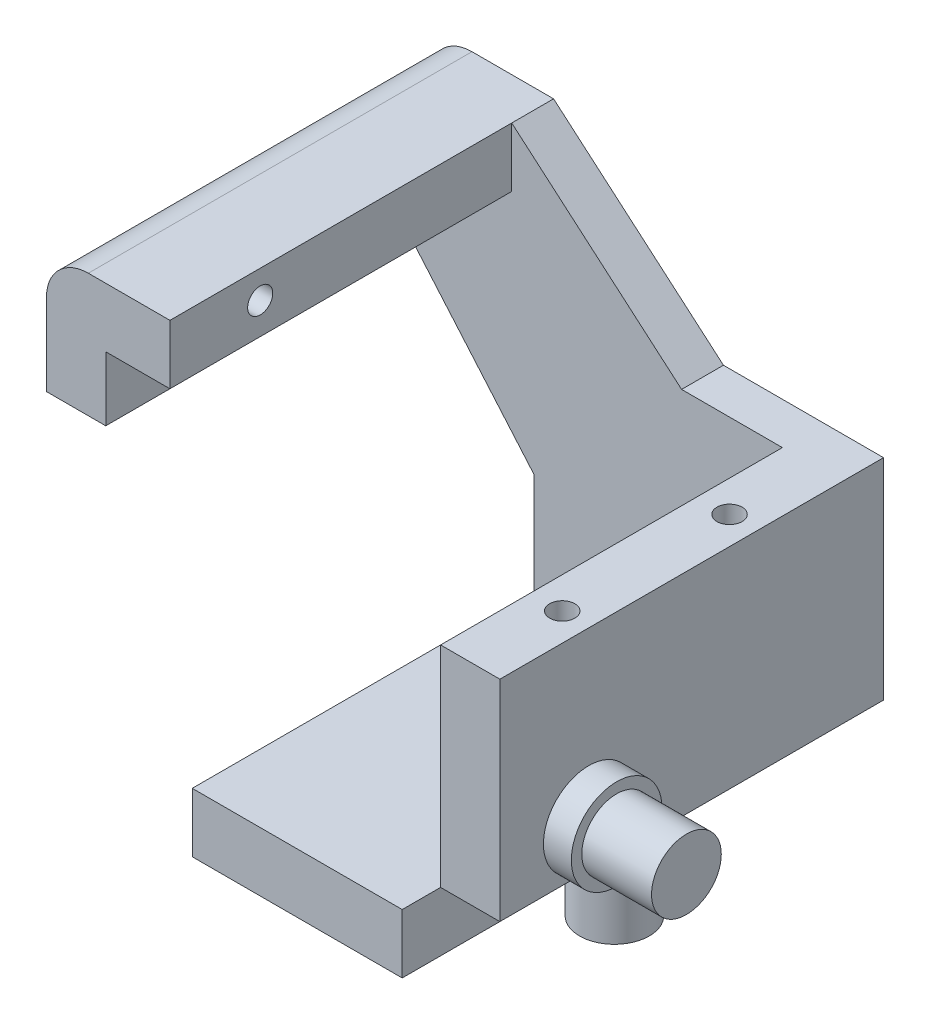
ISO-10303-21;
HEADER;
FILE_DESCRIPTION(('STEP AP214'),'2;1');
FILE_NAME('part.step','',(''),(''),'','','');
FILE_SCHEMA(('AUTOMOTIVE_DESIGN { 1 0 10303 214 1 1 1 1 }'));
ENDSEC;
DATA;
#1=APPLICATION_CONTEXT('core data for automotive mechanical design processes');
#2=APPLICATION_PROTOCOL_DEFINITION('international standard','automotive_design',2000,#1);
#3=PRODUCT_CONTEXT('',#1,'mechanical');
#4=PRODUCT('Part','Part','',(#3));
#5=PRODUCT_RELATED_PRODUCT_CATEGORY('part','',(#4));
#6=PRODUCT_DEFINITION_FORMATION('','',#4);
#7=PRODUCT_DEFINITION_CONTEXT('part definition',#1,'design');
#8=PRODUCT_DEFINITION('design','',#6,#7);
#9=PRODUCT_DEFINITION_SHAPE('','',#8);
#10=(LENGTH_UNIT() NAMED_UNIT(*) SI_UNIT(.MILLI.,.METRE.));
#11=(NAMED_UNIT(*) PLANE_ANGLE_UNIT() SI_UNIT($,.RADIAN.));
#12=(NAMED_UNIT(*) SI_UNIT($,.STERADIAN.) SOLID_ANGLE_UNIT());
#13=UNCERTAINTY_MEASURE_WITH_UNIT(LENGTH_MEASURE(1.E-05),#10,'distance_accuracy_value','');
#14=(GEOMETRIC_REPRESENTATION_CONTEXT(3) GLOBAL_UNCERTAINTY_ASSIGNED_CONTEXT((#13)) GLOBAL_UNIT_ASSIGNED_CONTEXT((#10,
#11,#12)) REPRESENTATION_CONTEXT('',''));
#15=CARTESIAN_POINT('',(0.,0.,0.));
#16=DIRECTION('',(0.,0.,1.));
#17=DIRECTION('',(1.,0.,0.));
#18=AXIS2_PLACEMENT_3D('',#15,#16,#17);
#19=CARTESIAN_POINT('',(-16.25,-16.25,27.5));
#20=DIRECTION('',(1.,0.,0.));
#21=DIRECTION('',(0.,0.,-1.));
#22=AXIS2_PLACEMENT_3D('',#19,#20,#21);
#23=PLANE('',#22);
#24=DIRECTION('',(0.,0.,1.));
#25=VECTOR('',#24,1.);
#26=CARTESIAN_POINT('',(-16.25,7.4,0.));
#27=LINE('',#26,#25);
#28=CARTESIAN_POINT('',(-16.25,7.4,0.));
#29=VERTEX_POINT('',#28);
#30=CARTESIAN_POINT('',(-16.25,7.4,3.));
#31=VERTEX_POINT('',#30);
#32=EDGE_CURVE('E169',#29,#31,#27,.T.);
#33=ORIENTED_EDGE('',*,*,#32,.T.);
#34=DIRECTION('',(0.,0.,1.));
#35=VECTOR('',#34,1.);
#36=CARTESIAN_POINT('',(-16.25,7.4,3.));
#37=LINE('',#36,#35);
#38=CARTESIAN_POINT('',(-16.25,7.4,27.5));
#39=VERTEX_POINT('',#38);
#40=EDGE_CURVE('E241',#31,#39,#37,.T.);
#41=ORIENTED_EDGE('',*,*,#40,.T.);
#42=DIRECTION('',(0.,-1.,0.));
#43=VECTOR('',#42,1.);
#44=CARTESIAN_POINT('',(-16.25,-16.25,27.5));
#45=LINE('',#44,#43);
#46=CARTESIAN_POINT('',(-16.25,13.25,27.5));
#47=VERTEX_POINT('',#46);
#48=EDGE_CURVE('E84',#47,#39,#45,.T.);
#49=ORIENTED_EDGE('',*,*,#48,.F.);
#50=DIRECTION('',(0.,0.,-1.));
#51=VECTOR('',#50,1.);
#52=CARTESIAN_POINT('',(-16.25,13.25,27.5));
#53=LINE('',#52,#51);
#54=CARTESIAN_POINT('',(-16.25,13.25,0.));
#55=VERTEX_POINT('',#54);
#56=EDGE_CURVE('E77',#47,#55,#53,.T.);
#57=ORIENTED_EDGE('',*,*,#56,.T.);
#58=DIRECTION('',(0.,-1.,0.));
#59=VECTOR('',#58,1.);
#60=CARTESIAN_POINT('',(-16.25,-16.25,0.));
#61=LINE('',#60,#59);
#62=EDGE_CURVE('E91',#55,#29,#61,.T.);
#63=ORIENTED_EDGE('',*,*,#62,.T.);
#64=EDGE_LOOP('',(#33,#41,#49,#57,#63));
#65=FACE_BOUND('',#64,.T.);
#66=ADVANCED_FACE('F36',(#65),#23,.F.);
#67=CARTESIAN_POINT('',(-16.25,-16.25,27.5));
#68=DIRECTION('',(0.,1.,0.));
#69=DIRECTION('',(0.,0.,1.));
#70=AXIS2_PLACEMENT_3D('',#67,#68,#69);
#71=PLANE('',#70);
#72=DIRECTION('',(0.,0.,1.));
#73=VECTOR('',#72,1.);
#74=CARTESIAN_POINT('',(-5.80000000000001,-16.25,3.));
#75=LINE('',#74,#73);
#76=CARTESIAN_POINT('',(-5.80000000000001,-16.25,0.));
#77=VERTEX_POINT('',#76);
#78=CARTESIAN_POINT('',(-5.80000000000001,-16.25,27.5));
#79=VERTEX_POINT('',#78);
#80=EDGE_CURVE('E230',#77,#79,#75,.T.);
#81=ORIENTED_EDGE('',*,*,#80,.F.);
#82=DIRECTION('',(1.,0.,0.));
#83=VECTOR('',#82,1.);
#84=CARTESIAN_POINT('',(-16.25,-16.25,0.));
#85=LINE('',#84,#83);
#86=CARTESIAN_POINT('',(9.25,-16.25,0.));
#87=VERTEX_POINT('',#86);
#88=EDGE_CURVE('E99',#77,#87,#85,.T.);
#89=ORIENTED_EDGE('',*,*,#88,.T.);
#90=DIRECTION('',(0.,0.,1.));
#91=VECTOR('',#90,1.);
#92=CARTESIAN_POINT('',(9.25,-16.25,0.));
#93=LINE('',#92,#91);
#94=CARTESIAN_POINT('',(9.25,-16.25,9.04));
#95=VERTEX_POINT('',#94);
#96=EDGE_CURVE('E207',#87,#95,#93,.T.);
#97=ORIENTED_EDGE('',*,*,#96,.T.);
#98=CARTESIAN_POINT('',(6.,-16.25,9.04));
#99=DIRECTION('',(0.,1.,0.));
#100=DIRECTION('',(0.,0.,1.));
#101=AXIS2_PLACEMENT_3D('',#98,#99,#100);
#102=CIRCLE('',#101,3.25);
#103=EDGE_CURVE('E115',#95,#95,#102,.F.);
#104=ORIENTED_EDGE('',*,*,#103,.F.);
#105=CARTESIAN_POINT('',(9.25,-16.25,27.5));
#106=VERTEX_POINT('',#105);
#107=EDGE_CURVE('E211',#95,#106,#93,.T.);
#108=ORIENTED_EDGE('',*,*,#107,.T.);
#109=DIRECTION('',(1.,0.,0.));
#110=VECTOR('',#109,1.);
#111=CARTESIAN_POINT('',(-16.25,-16.25,27.5));
#112=LINE('',#111,#110);
#113=EDGE_CURVE('E289',#79,#106,#112,.T.);
#114=ORIENTED_EDGE('',*,*,#113,.F.);
#115=EDGE_LOOP('',(#81,#89,#97,#104,#108,#114));
#116=FACE_BOUND('',#115,.T.);
#117=ADVANCED_FACE('F425',(#116),#71,.F.);
#118=CARTESIAN_POINT('',(-13.25,13.25,0.));
#119=DIRECTION('',(0.,0.,1.));
#120=DIRECTION('',(1.,0.,0.));
#121=AXIS2_PLACEMENT_3D('',#118,#119,#120);
#122=PLANE('',#121);
#123=DIRECTION('',(0.651281240201258,-0.758836442299598,0.));
#124=VECTOR('',#123,1.);
#125=CARTESIAN_POINT('',(-5.8,-4.77575500805203,0.));
#126=LINE('',#125,#124);
#127=CARTESIAN_POINT('',(-5.8,-4.77575500805203,0.));
#128=VERTEX_POINT('',#127);
#129=EDGE_CURVE('E98',#29,#128,#126,.T.);
#130=ORIENTED_EDGE('',*,*,#129,.F.);
#131=ORIENTED_EDGE('',*,*,#62,.F.);
#132=CARTESIAN_POINT('',(-13.25,13.25,0.));
#133=DIRECTION('',(0.,0.,1.));
#134=DIRECTION('',(1.,0.,0.));
#135=AXIS2_PLACEMENT_3D('',#132,#133,#134);
#136=CIRCLE('',#135,3.);
#137=CARTESIAN_POINT('',(-13.25,16.25,0.));
#138=VERTEX_POINT('',#137);
#139=EDGE_CURVE('E74',#138,#55,#136,.T.);
#140=ORIENTED_EDGE('',*,*,#139,.F.);
#141=DIRECTION('',(-1.,0.,0.));
#142=VECTOR('',#141,1.);
#143=CARTESIAN_POINT('',(-13.25,16.25,0.));
#144=LINE('',#143,#142);
#145=CARTESIAN_POINT('',(-7.4,16.25,0.));
#146=VERTEX_POINT('',#145);
#147=EDGE_CURVE('E85',#146,#138,#144,.T.);
#148=ORIENTED_EDGE('',*,*,#147,.F.);
#149=DIRECTION('',(0.758836442299598,-0.651281240201258,0.));
#150=VECTOR('',#149,1.);
#151=CARTESIAN_POINT('',(4.77575500805203,5.8,0.));
#152=LINE('',#151,#150);
#153=CARTESIAN_POINT('',(4.77575500805203,5.8,0.));
#154=VERTEX_POINT('',#153);
#155=EDGE_CURVE('E174',#146,#154,#152,.T.);
#156=ORIENTED_EDGE('',*,*,#155,.T.);
#157=DIRECTION('',(1.,0.,0.));
#158=VECTOR('',#157,1.);
#159=CARTESIAN_POINT('',(16.25,5.8,0.));
#160=LINE('',#159,#158);
#161=CARTESIAN_POINT('',(16.25,5.8,0.));
#162=VERTEX_POINT('',#161);
#163=EDGE_CURVE('E177',#154,#162,#160,.T.);
#164=ORIENTED_EDGE('',*,*,#163,.T.);
#165=DIRECTION('',(0.,1.,0.));
#166=VECTOR('',#165,1.);
#167=CARTESIAN_POINT('',(16.25,-16.25,0.));
#168=LINE('',#167,#166);
#169=CARTESIAN_POINT('',(16.25,-9.25,0.));
#170=VERTEX_POINT('',#169);
#171=EDGE_CURVE('E103',#170,#162,#168,.T.);
#172=ORIENTED_EDGE('',*,*,#171,.F.);
#173=DIRECTION('',(-1.,0.,0.));
#174=VECTOR('',#173,1.);
#175=CARTESIAN_POINT('',(16.25,-9.25,0.));
#176=LINE('',#175,#174);
#177=CARTESIAN_POINT('',(12.,-9.25,0.));
#178=VERTEX_POINT('',#177);
#179=EDGE_CURVE('E192',#170,#178,#176,.T.);
#180=ORIENTED_EDGE('',*,*,#179,.T.);
#181=CARTESIAN_POINT('',(12.,-12.,0.));
#182=DIRECTION('',(0.,0.,1.));
#183=DIRECTION('',(1.,0.,0.));
#184=AXIS2_PLACEMENT_3D('',#181,#182,#183);
#185=CIRCLE('',#184,2.75);
#186=CARTESIAN_POINT('',(9.25,-12.,0.));
#187=VERTEX_POINT('',#186);
#188=EDGE_CURVE('E195',#178,#187,#185,.T.);
#189=ORIENTED_EDGE('',*,*,#188,.T.);
#190=DIRECTION('',(0.,-1.,0.));
#191=VECTOR('',#190,1.);
#192=CARTESIAN_POINT('',(9.25,-16.25,0.));
#193=LINE('',#192,#191);
#194=EDGE_CURVE('E199',#187,#87,#193,.T.);
#195=ORIENTED_EDGE('',*,*,#194,.T.);
#196=ORIENTED_EDGE('',*,*,#88,.F.);
#197=DIRECTION('',(0.,-1.,0.));
#198=VECTOR('',#197,1.);
#199=CARTESIAN_POINT('',(-5.80000000000001,-16.25,0.));
#200=LINE('',#199,#198);
#201=EDGE_CURVE('E159',#128,#77,#200,.T.);
#202=ORIENTED_EDGE('',*,*,#201,.F.);
#203=EDGE_LOOP('',(#130,#131,#140,#148,#156,#164,#172,#180,#189,#195,#196,#202));
#204=FACE_BOUND('',#203,.T.);
#205=ADVANCED_FACE('F95',(#204),#122,.F.);
#206=CARTESIAN_POINT('',(0.,0.,3.));
#207=DIRECTION('',(0.,0.,-1.));
#208=DIRECTION('',(-1.,0.,0.));
#209=AXIS2_PLACEMENT_3D('',#206,#207,#208);
#210=PLANE('',#209);
#211=DIRECTION('',(0.651281240201258,-0.758836442299598,0.));
#212=VECTOR('',#211,1.);
#213=CARTESIAN_POINT('',(-5.8,-4.77575500805203,3.));
#214=LINE('',#213,#212);
#215=CARTESIAN_POINT('',(-5.8,-4.77575500805203,3.));
#216=VERTEX_POINT('',#215);
#217=EDGE_CURVE('E162',#31,#216,#214,.T.);
#218=ORIENTED_EDGE('',*,*,#217,.T.);
#219=DIRECTION('',(0.,-1.,0.));
#220=VECTOR('',#219,1.);
#221=CARTESIAN_POINT('',(-5.80000000000001,-16.25,3.));
#222=LINE('',#221,#220);
#223=CARTESIAN_POINT('',(-5.80000000000001,-12.,3.));
#224=VERTEX_POINT('',#223);
#225=EDGE_CURVE('E150',#216,#224,#222,.T.);
#226=ORIENTED_EDGE('',*,*,#225,.T.);
#227=DIRECTION('',(1.,0.,0.));
#228=VECTOR('',#227,1.);
#229=CARTESIAN_POINT('',(-12.,-12.,3.));
#230=LINE('',#229,#228);
#231=CARTESIAN_POINT('',(9.25,-12.,3.));
#232=VERTEX_POINT('',#231);
#233=EDGE_CURVE('E271',#224,#232,#230,.T.);
#234=ORIENTED_EDGE('',*,*,#233,.T.);
#235=CARTESIAN_POINT('',(12.,-12.,3.));
#236=DIRECTION('',(0.,0.,-1.));
#237=DIRECTION('',(-1.,0.,0.));
#238=AXIS2_PLACEMENT_3D('',#235,#236,#237);
#239=CIRCLE('',#238,2.75);
#240=CARTESIAN_POINT('',(12.,-9.25,3.));
#241=VERTEX_POINT('',#240);
#242=EDGE_CURVE('E39',#232,#241,#239,.T.);
#243=ORIENTED_EDGE('',*,*,#242,.T.);
#244=DIRECTION('',(0.,1.,0.));
#245=VECTOR('',#244,1.);
#246=CARTESIAN_POINT('',(12.,-12.,3.));
#247=LINE('',#246,#245);
#248=CARTESIAN_POINT('',(12.,5.8,3.));
#249=VERTEX_POINT('',#248);
#250=EDGE_CURVE('E274',#241,#249,#247,.T.);
#251=ORIENTED_EDGE('',*,*,#250,.T.);
#252=DIRECTION('',(1.,0.,0.));
#253=VECTOR('',#252,1.);
#254=CARTESIAN_POINT('',(16.25,5.8,3.));
#255=LINE('',#254,#253);
#256=CARTESIAN_POINT('',(4.77575500805203,5.8,3.));
#257=VERTEX_POINT('',#256);
#258=EDGE_CURVE('E178',#257,#249,#255,.T.);
#259=ORIENTED_EDGE('',*,*,#258,.F.);
#260=DIRECTION('',(0.758836442299598,-0.651281240201258,0.));
#261=VECTOR('',#260,1.);
#262=CARTESIAN_POINT('',(4.77575500805203,5.8,3.));
#263=LINE('',#262,#261);
#264=CARTESIAN_POINT('',(-7.4,16.25,3.));
#265=VERTEX_POINT('',#264);
#266=EDGE_CURVE('E171',#265,#257,#263,.T.);
#267=ORIENTED_EDGE('',*,*,#266,.F.);
#268=DIRECTION('',(0.,-1.,0.));
#269=VECTOR('',#268,1.);
#270=CARTESIAN_POINT('',(-7.4,16.25,3.));
#271=LINE('',#270,#269);
#272=CARTESIAN_POINT('',(-7.4,12.,3.));
#273=VERTEX_POINT('',#272);
#274=EDGE_CURVE('E247',#265,#273,#271,.T.);
#275=ORIENTED_EDGE('',*,*,#274,.T.);
#276=DIRECTION('',(-1.,0.,0.));
#277=VECTOR('',#276,1.);
#278=CARTESIAN_POINT('',(-12.,12.,3.));
#279=LINE('',#278,#277);
#280=CARTESIAN_POINT('',(-12.,12.,3.));
#281=VERTEX_POINT('',#280);
#282=EDGE_CURVE('E106',#273,#281,#279,.T.);
#283=ORIENTED_EDGE('',*,*,#282,.T.);
#284=DIRECTION('',(0.,-1.,0.));
#285=VECTOR('',#284,1.);
#286=CARTESIAN_POINT('',(-12.,-12.,3.));
#287=LINE('',#286,#285);
#288=CARTESIAN_POINT('',(-12.,7.4,3.));
#289=VERTEX_POINT('',#288);
#290=EDGE_CURVE('E268',#281,#289,#287,.T.);
#291=ORIENTED_EDGE('',*,*,#290,.T.);
#292=DIRECTION('',(1.,0.,0.));
#293=VECTOR('',#292,1.);
#294=CARTESIAN_POINT('',(-16.25,7.4,3.));
#295=LINE('',#294,#293);
#296=EDGE_CURVE('E227',#31,#289,#295,.T.);
#297=ORIENTED_EDGE('',*,*,#296,.F.);
#298=EDGE_LOOP('',(#218,#226,#234,#243,#251,#259,#267,#275,#283,#291,#297));
#299=FACE_BOUND('',#298,.T.);
#300=ADVANCED_FACE('F403',(#299),#210,.F.);
#301=CARTESIAN_POINT('',(-13.25,13.25,27.5));
#302=DIRECTION('',(0.,0.,1.));
#303=DIRECTION('',(1.,0.,0.));
#304=AXIS2_PLACEMENT_3D('',#301,#302,#303);
#305=PLANE('',#304);
#306=DIRECTION('',(0.,-1.,0.));
#307=VECTOR('',#306,1.);
#308=CARTESIAN_POINT('',(9.25,-16.25,27.5));
#309=LINE('',#308,#307);
#310=CARTESIAN_POINT('',(9.25,-12.,27.5));
#311=VERTEX_POINT('',#310);
#312=EDGE_CURVE('E196',#311,#106,#309,.T.);
#313=ORIENTED_EDGE('',*,*,#312,.F.);
#314=DIRECTION('',(1.,0.,0.));
#315=VECTOR('',#314,1.);
#316=CARTESIAN_POINT('',(-12.,-12.,27.5));
#317=LINE('',#316,#315);
#318=CARTESIAN_POINT('',(-5.80000000000001,-12.,27.5));
#319=VERTEX_POINT('',#318);
#320=EDGE_CURVE('E280',#319,#311,#317,.T.);
#321=ORIENTED_EDGE('',*,*,#320,.F.);
#322=DIRECTION('',(0.,1.,0.));
#323=VECTOR('',#322,1.);
#324=CARTESIAN_POINT('',(-5.80000000000001,-16.25,27.5));
#325=LINE('',#324,#323);
#326=EDGE_CURVE('E231',#79,#319,#325,.T.);
#327=ORIENTED_EDGE('',*,*,#326,.F.);
#328=ORIENTED_EDGE('',*,*,#113,.T.);
#329=EDGE_LOOP('',(#313,#321,#327,#328));
#330=FACE_BOUND('',#329,.T.);
#331=ADVANCED_FACE('F449',(#330),#305,.T.);
#332=ORIENTED_EDGE('',*,*,#48,.T.);
#333=DIRECTION('',(1.,0.,0.));
#334=VECTOR('',#333,1.);
#335=CARTESIAN_POINT('',(-16.25,7.4,27.5));
#336=LINE('',#335,#334);
#337=CARTESIAN_POINT('',(-12.,7.4,27.5));
#338=VERTEX_POINT('',#337);
#339=EDGE_CURVE('E226',#39,#338,#336,.T.);
#340=ORIENTED_EDGE('',*,*,#339,.T.);
#341=DIRECTION('',(0.,-1.,0.));
#342=VECTOR('',#341,1.);
#343=CARTESIAN_POINT('',(-12.,-12.,27.5));
#344=LINE('',#343,#342);
#345=CARTESIAN_POINT('',(-12.,12.,27.5));
#346=VERTEX_POINT('',#345);
#347=EDGE_CURVE('E267',#346,#338,#344,.T.);
#348=ORIENTED_EDGE('',*,*,#347,.F.);
#349=DIRECTION('',(-1.,0.,0.));
#350=VECTOR('',#349,1.);
#351=CARTESIAN_POINT('',(-12.,12.,27.5));
#352=LINE('',#351,#350);
#353=CARTESIAN_POINT('',(-7.4,12.,27.5));
#354=VERTEX_POINT('',#353);
#355=EDGE_CURVE('E272',#354,#346,#352,.T.);
#356=ORIENTED_EDGE('',*,*,#355,.F.);
#357=DIRECTION('',(0.,-1.,0.));
#358=VECTOR('',#357,1.);
#359=CARTESIAN_POINT('',(-7.4,16.25,27.5));
#360=LINE('',#359,#358);
#361=CARTESIAN_POINT('',(-7.4,16.25,27.5));
#362=VERTEX_POINT('',#361);
#363=EDGE_CURVE('E251',#362,#354,#360,.T.);
#364=ORIENTED_EDGE('',*,*,#363,.F.);
#365=DIRECTION('',(-1.,0.,0.));
#366=VECTOR('',#365,1.);
#367=CARTESIAN_POINT('',(-13.25,16.25,27.5));
#368=LINE('',#367,#366);
#369=CARTESIAN_POINT('',(-13.25,16.25,27.5));
#370=VERTEX_POINT('',#369);
#371=EDGE_CURVE('E294',#362,#370,#368,.T.);
#372=ORIENTED_EDGE('',*,*,#371,.T.);
#373=CARTESIAN_POINT('',(-13.25,13.25,27.5));
#374=DIRECTION('',(0.,0.,1.));
#375=DIRECTION('',(1.,0.,0.));
#376=AXIS2_PLACEMENT_3D('',#373,#374,#375);
#377=CIRCLE('',#376,3.);
#378=EDGE_CURVE('E61',#370,#47,#377,.T.);
#379=ORIENTED_EDGE('',*,*,#378,.T.);
#380=EDGE_LOOP('',(#332,#340,#348,#356,#364,#372,#379));
#381=FACE_BOUND('',#380,.T.);
#382=ADVANCED_FACE('F297',(#381),#305,.T.);
#383=CARTESIAN_POINT('',(-12.,-12.,3.));
#384=DIRECTION('',(-1.,0.,0.));
#385=DIRECTION('',(0.,0.,1.));
#386=AXIS2_PLACEMENT_3D('',#383,#384,#385);
#387=PLANE('',#386);
#388=DIRECTION('',(0.,0.,1.));
#389=VECTOR('',#388,1.);
#390=CARTESIAN_POINT('',(-12.,7.4,3.));
#391=LINE('',#390,#389);
#392=EDGE_CURVE('E238',#289,#338,#391,.T.);
#393=ORIENTED_EDGE('',*,*,#392,.F.);
#394=ORIENTED_EDGE('',*,*,#290,.F.);
#395=DIRECTION('',(0.,0.,1.));
#396=VECTOR('',#395,1.);
#397=CARTESIAN_POINT('',(-12.,12.,3.));
#398=LINE('',#397,#396);
#399=EDGE_CURVE('E100',#281,#346,#398,.T.);
#400=ORIENTED_EDGE('',*,*,#399,.T.);
#401=ORIENTED_EDGE('',*,*,#347,.T.);
#402=EDGE_LOOP('',(#393,#394,#400,#401));
#403=FACE_BOUND('',#402,.T.);
#404=ADVANCED_FACE('F380',(#403),#387,.F.);
#405=CARTESIAN_POINT('',(16.25,-16.25,27.5));
#406=DIRECTION('',(-1.,0.,0.));
#407=DIRECTION('',(0.,0.,1.));
#408=AXIS2_PLACEMENT_3D('',#405,#406,#407);
#409=PLANE('',#408);
#410=ORIENTED_EDGE('',*,*,#171,.T.);
#411=DIRECTION('',(0.,0.,1.));
#412=VECTOR('',#411,1.);
#413=CARTESIAN_POINT('',(16.25,5.8,3.));
#414=LINE('',#413,#412);
#415=CARTESIAN_POINT('',(16.25,5.8,27.5));
#416=VERTEX_POINT('',#415);
#417=EDGE_CURVE('E261',#162,#416,#414,.T.);
#418=ORIENTED_EDGE('',*,*,#417,.T.);
#419=DIRECTION('',(0.,1.,0.));
#420=VECTOR('',#419,1.);
#421=CARTESIAN_POINT('',(16.25,-16.25,27.5));
#422=LINE('',#421,#420);
#423=CARTESIAN_POINT('',(16.25,-9.25,27.5));
#424=VERTEX_POINT('',#423);
#425=EDGE_CURVE('E292',#424,#416,#422,.T.);
#426=ORIENTED_EDGE('',*,*,#425,.F.);
#427=DIRECTION('',(0.,0.,1.));
#428=VECTOR('',#427,1.);
#429=CARTESIAN_POINT('',(16.25,-9.25,0.));
#430=LINE('',#429,#428);
#431=CARTESIAN_POINT('',(16.25,-9.25,21.13));
#432=VERTEX_POINT('',#431);
#433=EDGE_CURVE('E202',#432,#424,#430,.T.);
#434=ORIENTED_EDGE('',*,*,#433,.F.);
#435=CARTESIAN_POINT('',(16.25,-6.,21.13));
#436=DIRECTION('',(-1.,0.,0.));
#437=DIRECTION('',(0.,0.,1.));
#438=AXIS2_PLACEMENT_3D('',#435,#436,#437);
#439=CIRCLE('',#438,3.25);
#440=EDGE_CURVE('E117',#432,#432,#439,.F.);
#441=ORIENTED_EDGE('',*,*,#440,.F.);
#442=EDGE_CURVE('E218',#170,#432,#430,.T.);
#443=ORIENTED_EDGE('',*,*,#442,.F.);
#444=EDGE_LOOP('',(#410,#418,#426,#434,#441,#443));
#445=FACE_BOUND('',#444,.T.);
#446=ADVANCED_FACE('F436',(#445),#409,.F.);
#447=DIRECTION('',(-1.,0.,0.));
#448=VECTOR('',#447,1.);
#449=CARTESIAN_POINT('',(16.25,-9.25,27.5));
#450=LINE('',#449,#448);
#451=CARTESIAN_POINT('',(12.,-9.25,27.5));
#452=VERTEX_POINT('',#451);
#453=EDGE_CURVE('E189',#424,#452,#450,.T.);
#454=ORIENTED_EDGE('',*,*,#453,.F.);
#455=ORIENTED_EDGE('',*,*,#425,.T.);
#456=DIRECTION('',(-1.,0.,0.));
#457=VECTOR('',#456,1.);
#458=CARTESIAN_POINT('',(16.25,5.8,27.5));
#459=LINE('',#458,#457);
#460=CARTESIAN_POINT('',(12.,5.8,27.5));
#461=VERTEX_POINT('',#460);
#462=EDGE_CURVE('E246',#416,#461,#459,.T.);
#463=ORIENTED_EDGE('',*,*,#462,.T.);
#464=DIRECTION('',(0.,1.,0.));
#465=VECTOR('',#464,1.);
#466=CARTESIAN_POINT('',(12.,-12.,27.5));
#467=LINE('',#466,#465);
#468=EDGE_CURVE('E283',#452,#461,#467,.T.);
#469=ORIENTED_EDGE('',*,*,#468,.F.);
#470=EDGE_LOOP('',(#454,#455,#463,#469));
#471=FACE_BOUND('',#470,.T.);
#472=ADVANCED_FACE('F439',(#471),#305,.T.);
#473=CARTESIAN_POINT('',(12.,-12.,3.));
#474=DIRECTION('',(1.,0.,0.));
#475=DIRECTION('',(0.,0.,-1.));
#476=AXIS2_PLACEMENT_3D('',#473,#474,#475);
#477=PLANE('',#476);
#478=ORIENTED_EDGE('',*,*,#250,.F.);
#479=DIRECTION('',(0.,0.,1.));
#480=VECTOR('',#479,1.);
#481=CARTESIAN_POINT('',(12.,-9.25,0.));
#482=LINE('',#481,#480);
#483=EDGE_CURVE('E217',#241,#452,#482,.T.);
#484=ORIENTED_EDGE('',*,*,#483,.T.);
#485=ORIENTED_EDGE('',*,*,#468,.T.);
#486=DIRECTION('',(0.,0.,1.));
#487=VECTOR('',#486,1.);
#488=CARTESIAN_POINT('',(12.,5.8,3.));
#489=LINE('',#488,#487);
#490=EDGE_CURVE('E264',#249,#461,#489,.T.);
#491=ORIENTED_EDGE('',*,*,#490,.F.);
#492=EDGE_LOOP('',(#478,#484,#485,#491));
#493=FACE_BOUND('',#492,.T.);
#494=ADVANCED_FACE('F443',(#493),#477,.F.);
#495=CARTESIAN_POINT('',(-13.25,16.25,27.5));
#496=DIRECTION('',(0.,-1.,0.));
#497=DIRECTION('',(0.,0.,-1.));
#498=AXIS2_PLACEMENT_3D('',#495,#496,#497);
#499=PLANE('',#498);
#500=DIRECTION('',(0.,0.,1.));
#501=VECTOR('',#500,1.);
#502=CARTESIAN_POINT('',(-7.4,16.25,3.));
#503=LINE('',#502,#501);
#504=EDGE_CURVE('E250',#265,#362,#503,.T.);
#505=ORIENTED_EDGE('',*,*,#504,.F.);
#506=DIRECTION('',(0.,0.,1.));
#507=VECTOR('',#506,1.);
#508=CARTESIAN_POINT('',(-7.4,16.25,0.));
#509=LINE('',#508,#507);
#510=EDGE_CURVE('E181',#146,#265,#509,.T.);
#511=ORIENTED_EDGE('',*,*,#510,.F.);
#512=ORIENTED_EDGE('',*,*,#147,.T.);
#513=DIRECTION('',(0.,0.,-1.));
#514=VECTOR('',#513,1.);
#515=CARTESIAN_POINT('',(-13.25,16.25,27.5));
#516=LINE('',#515,#514);
#517=EDGE_CURVE('E80',#370,#138,#516,.T.);
#518=ORIENTED_EDGE('',*,*,#517,.F.);
#519=ORIENTED_EDGE('',*,*,#371,.F.);
#520=EDGE_LOOP('',(#505,#511,#512,#518,#519));
#521=FACE_BOUND('',#520,.T.);
#522=ADVANCED_FACE('F302',(#521),#499,.F.);
#523=CARTESIAN_POINT('',(-13.25,13.25,27.5));
#524=DIRECTION('',(0.,0.,-1.));
#525=DIRECTION('',(-1.,0.,0.));
#526=AXIS2_PLACEMENT_3D('',#523,#524,#525);
#527=CYLINDRICAL_SURFACE('',#526,3.);
#528=ORIENTED_EDGE('',*,*,#139,.T.);
#529=ORIENTED_EDGE('',*,*,#56,.F.);
#530=ORIENTED_EDGE('',*,*,#378,.F.);
#531=ORIENTED_EDGE('',*,*,#517,.T.);
#532=EDGE_LOOP('',(#528,#529,#530,#531));
#533=FACE_BOUND('',#532,.T.);
#534=ADVANCED_FACE('F76',(#533),#527,.T.);
#535=CARTESIAN_POINT('',(-12.,12.,3.));
#536=DIRECTION('',(0.,1.,0.));
#537=DIRECTION('',(0.,0.,1.));
#538=AXIS2_PLACEMENT_3D('',#535,#536,#537);
#539=PLANE('',#538);
#540=ORIENTED_EDGE('',*,*,#282,.F.);
#541=DIRECTION('',(0.,0.,1.));
#542=VECTOR('',#541,1.);
#543=CARTESIAN_POINT('',(-7.4,12.,3.));
#544=LINE('',#543,#542);
#545=EDGE_CURVE('E258',#273,#354,#544,.T.);
#546=ORIENTED_EDGE('',*,*,#545,.T.);
#547=ORIENTED_EDGE('',*,*,#355,.T.);
#548=ORIENTED_EDGE('',*,*,#399,.F.);
#549=EDGE_LOOP('',(#540,#546,#547,#548));
#550=FACE_BOUND('',#549,.T.);
#551=ADVANCED_FACE('F375',(#550),#539,.F.);
#552=CARTESIAN_POINT('',(-12.,-12.,3.));
#553=DIRECTION('',(0.,-1.,0.));
#554=DIRECTION('',(0.,0.,-1.));
#555=AXIS2_PLACEMENT_3D('',#552,#553,#554);
#556=PLANE('',#555);
#557=ORIENTED_EDGE('',*,*,#320,.T.);
#558=DIRECTION('',(0.,0.,1.));
#559=VECTOR('',#558,1.);
#560=CARTESIAN_POINT('',(9.25,-12.,0.));
#561=LINE('',#560,#559);
#562=EDGE_CURVE('E215',#232,#311,#561,.T.);
#563=ORIENTED_EDGE('',*,*,#562,.F.);
#564=ORIENTED_EDGE('',*,*,#233,.F.);
#565=DIRECTION('',(0.,0.,1.));
#566=VECTOR('',#565,1.);
#567=CARTESIAN_POINT('',(-5.80000000000001,-12.,3.));
#568=LINE('',#567,#566);
#569=EDGE_CURVE('E243',#224,#319,#568,.T.);
#570=ORIENTED_EDGE('',*,*,#569,.T.);
#571=EDGE_LOOP('',(#557,#563,#564,#570));
#572=FACE_BOUND('',#571,.T.);
#573=ADVANCED_FACE('F419',(#572),#556,.F.);
#574=CARTESIAN_POINT('',(16.25,5.8,3.));
#575=DIRECTION('',(0.,1.,0.));
#576=DIRECTION('',(-1.,0.,0.));
#577=AXIS2_PLACEMENT_3D('',#574,#575,#576);
#578=PLANE('',#577);
#579=CARTESIAN_POINT('',(14.25,5.8,9.04));
#580=DIRECTION('',(0.,1.,0.));
#581=DIRECTION('',(-1.,0.,0.));
#582=AXIS2_PLACEMENT_3D('',#579,#580,#581);
#583=CIRCLE('',#582,0.9);
#584=CARTESIAN_POINT('',(13.35,5.8,9.04));
#585=VERTEX_POINT('',#584);
#586=EDGE_CURVE('E151',#585,#585,#583,.T.);
#587=ORIENTED_EDGE('',*,*,#586,.F.);
#588=EDGE_LOOP('',(#587));
#589=FACE_BOUND('',#588,.T.);
#590=CARTESIAN_POINT('',(14.25,5.8,21.03));
#591=DIRECTION('',(0.,1.,0.));
#592=DIRECTION('',(-1.,0.,0.));
#593=AXIS2_PLACEMENT_3D('',#590,#591,#592);
#594=CIRCLE('',#593,0.900000000000001);
#595=CARTESIAN_POINT('',(13.35,5.8,21.03));
#596=VERTEX_POINT('',#595);
#597=EDGE_CURVE('E154',#596,#596,#594,.T.);
#598=ORIENTED_EDGE('',*,*,#597,.F.);
#599=EDGE_LOOP('',(#598));
#600=FACE_BOUND('',#599,.T.);
#601=ORIENTED_EDGE('',*,*,#490,.T.);
#602=ORIENTED_EDGE('',*,*,#462,.F.);
#603=ORIENTED_EDGE('',*,*,#417,.F.);
#604=ORIENTED_EDGE('',*,*,#163,.F.);
#605=DIRECTION('',(0.,0.,1.));
#606=VECTOR('',#605,1.);
#607=CARTESIAN_POINT('',(4.77575500805203,5.8,0.));
#608=LINE('',#607,#606);
#609=EDGE_CURVE('E186',#154,#257,#608,.T.);
#610=ORIENTED_EDGE('',*,*,#609,.T.);
#611=ORIENTED_EDGE('',*,*,#258,.T.);
#612=EDGE_LOOP('',(#601,#602,#603,#604,#610,#611));
#613=FACE_BOUND('',#612,.T.);
#614=ADVANCED_FACE('F410',(#589,#600,#613),#578,.T.);
#615=CARTESIAN_POINT('',(-7.4,16.25,3.));
#616=DIRECTION('',(-1.,0.,0.));
#617=DIRECTION('',(0.,0.,1.));
#618=AXIS2_PLACEMENT_3D('',#615,#616,#617);
#619=PLANE('',#618);
#620=CARTESIAN_POINT('',(-7.4,14.25,21.03));
#621=DIRECTION('',(1.,0.,0.));
#622=DIRECTION('',(0.,0.,-1.));
#623=AXIS2_PLACEMENT_3D('',#620,#621,#622);
#624=CIRCLE('',#623,0.9);
#625=CARTESIAN_POINT('',(-7.4,14.25,20.13));
#626=VERTEX_POINT('',#625);
#627=EDGE_CURVE('E534',#626,#626,#624,.T.);
#628=ORIENTED_EDGE('',*,*,#627,.F.);
#629=EDGE_LOOP('',(#628));
#630=FACE_BOUND('',#629,.T.);
#631=ORIENTED_EDGE('',*,*,#363,.T.);
#632=ORIENTED_EDGE('',*,*,#545,.F.);
#633=ORIENTED_EDGE('',*,*,#274,.F.);
#634=ORIENTED_EDGE('',*,*,#504,.T.);
#635=EDGE_LOOP('',(#631,#632,#633,#634));
#636=FACE_BOUND('',#635,.T.);
#637=ADVANCED_FACE('F408',(#630,#636),#619,.F.);
#638=CARTESIAN_POINT('',(-5.80000000000001,-16.25,3.));
#639=DIRECTION('',(1.,0.,0.));
#640=DIRECTION('',(0.,1.,0.));
#641=AXIS2_PLACEMENT_3D('',#638,#639,#640);
#642=PLANE('',#641);
#643=CARTESIAN_POINT('',(-5.80000000000001,-14.25,9.04));
#644=DIRECTION('',(1.,0.,0.));
#645=DIRECTION('',(0.,1.,0.));
#646=AXIS2_PLACEMENT_3D('',#643,#644,#645);
#647=CIRCLE('',#646,0.9);
#648=CARTESIAN_POINT('',(-5.80000000000001,-13.35,9.04));
#649=VERTEX_POINT('',#648);
#650=EDGE_CURVE('E138',#649,#649,#647,.T.);
#651=ORIENTED_EDGE('',*,*,#650,.T.);
#652=EDGE_LOOP('',(#651));
#653=FACE_BOUND('',#652,.T.);
#654=CARTESIAN_POINT('',(-5.80000000000001,-14.25,21.03));
#655=DIRECTION('',(1.,0.,0.));
#656=DIRECTION('',(0.,1.,0.));
#657=AXIS2_PLACEMENT_3D('',#654,#655,#656);
#658=CIRCLE('',#657,0.900000000000001);
#659=CARTESIAN_POINT('',(-5.80000000000001,-13.35,21.03));
#660=VERTEX_POINT('',#659);
#661=EDGE_CURVE('E144',#660,#660,#658,.T.);
#662=ORIENTED_EDGE('',*,*,#661,.T.);
#663=EDGE_LOOP('',(#662));
#664=FACE_BOUND('',#663,.T.);
#665=ORIENTED_EDGE('',*,*,#569,.F.);
#666=ORIENTED_EDGE('',*,*,#225,.F.);
#667=DIRECTION('',(0.,0.,1.));
#668=VECTOR('',#667,1.);
#669=CARTESIAN_POINT('',(-5.8,-4.77575500805203,0.));
#670=LINE('',#669,#668);
#671=EDGE_CURVE('E164',#128,#216,#670,.T.);
#672=ORIENTED_EDGE('',*,*,#671,.F.);
#673=ORIENTED_EDGE('',*,*,#201,.T.);
#674=ORIENTED_EDGE('',*,*,#80,.T.);
#675=ORIENTED_EDGE('',*,*,#326,.T.);
#676=EDGE_LOOP('',(#665,#666,#672,#673,#674,#675));
#677=FACE_BOUND('',#676,.T.);
#678=ADVANCED_FACE('F401',(#653,#664,#677),#642,.F.);
#679=CARTESIAN_POINT('',(-16.25,7.4,3.));
#680=DIRECTION('',(0.,-1.,0.));
#681=DIRECTION('',(1.,0.,0.));
#682=AXIS2_PLACEMENT_3D('',#679,#680,#681);
#683=PLANE('',#682);
#684=CARTESIAN_POINT('',(-14.25,7.4,9.04));
#685=DIRECTION('',(0.,-1.,0.));
#686=DIRECTION('',(1.,0.,0.));
#687=AXIS2_PLACEMENT_3D('',#684,#685,#686);
#688=CIRCLE('',#687,0.900000000000002);
#689=CARTESIAN_POINT('',(-13.35,7.4,9.04));
#690=VERTEX_POINT('',#689);
#691=EDGE_CURVE('E529',#690,#690,#688,.T.);
#692=ORIENTED_EDGE('',*,*,#691,.F.);
#693=EDGE_LOOP('',(#692));
#694=FACE_BOUND('',#693,.T.);
#695=ORIENTED_EDGE('',*,*,#339,.F.);
#696=ORIENTED_EDGE('',*,*,#40,.F.);
#697=ORIENTED_EDGE('',*,*,#296,.T.);
#698=ORIENTED_EDGE('',*,*,#392,.T.);
#699=EDGE_LOOP('',(#695,#696,#697,#698));
#700=FACE_BOUND('',#699,.T.);
#701=ADVANCED_FACE('F383',(#694,#700),#683,.T.);
#702=CARTESIAN_POINT('',(6.,-18.25,9.04));
#703=DIRECTION('',(0.,1.,0.));
#704=DIRECTION('',(0.,0.,1.));
#705=AXIS2_PLACEMENT_3D('',#702,#703,#704);
#706=CYLINDRICAL_SURFACE('',#705,3.25);
#707=CARTESIAN_POINT('',(6.,-18.25,9.04));
#708=DIRECTION('',(0.,-1.,0.));
#709=DIRECTION('',(0.,0.,-1.));
#710=AXIS2_PLACEMENT_3D('',#707,#708,#709);
#711=CIRCLE('',#710,3.25);
#712=CARTESIAN_POINT('',(6.,-18.25,5.79));
#713=VERTEX_POINT('',#712);
#714=EDGE_CURVE('E223',#713,#713,#711,.T.);
#715=ORIENTED_EDGE('',*,*,#714,.F.);
#716=EDGE_LOOP('',(#715));
#717=FACE_BOUND('',#716,.T.);
#718=ORIENTED_EDGE('',*,*,#103,.T.);
#719=EDGE_LOOP('',(#718));
#720=FACE_BOUND('',#719,.T.);
#721=ADVANCED_FACE('F519',(#717,#720),#706,.T.);
#722=CARTESIAN_POINT('',(6.,-18.25,9.04));
#723=DIRECTION('',(0.,-1.,0.));
#724=DIRECTION('',(0.,0.,-1.));
#725=AXIS2_PLACEMENT_3D('',#722,#723,#724);
#726=PLANE('',#725);
#727=CARTESIAN_POINT('',(6.,-18.25,9.04));
#728=DIRECTION('',(0.,-1.,0.));
#729=DIRECTION('',(0.,0.,-1.));
#730=AXIS2_PLACEMENT_3D('',#727,#728,#729);
#731=CIRCLE('',#730,2.5);
#732=CARTESIAN_POINT('',(6.,-18.25,6.54));
#733=VERTEX_POINT('',#732);
#734=EDGE_CURVE('E11',#733,#733,#731,.T.);
#735=ORIENTED_EDGE('',*,*,#734,.F.);
#736=EDGE_LOOP('',(#735));
#737=FACE_BOUND('',#736,.T.);
#738=ORIENTED_EDGE('',*,*,#714,.T.);
#739=EDGE_LOOP('',(#738));
#740=FACE_BOUND('',#739,.T.);
#741=ADVANCED_FACE('F515',(#737,#740),#726,.T.);
#742=CARTESIAN_POINT('',(18.25,-6.,21.13));
#743=DIRECTION('',(-1.,0.,0.));
#744=DIRECTION('',(0.,0.,1.));
#745=AXIS2_PLACEMENT_3D('',#742,#743,#744);
#746=CYLINDRICAL_SURFACE('',#745,3.25);
#747=CARTESIAN_POINT('',(18.25,-6.,21.13));
#748=DIRECTION('',(1.,0.,0.));
#749=DIRECTION('',(0.,0.,-1.));
#750=AXIS2_PLACEMENT_3D('',#747,#748,#749);
#751=CIRCLE('',#750,3.25);
#752=CARTESIAN_POINT('',(18.25,-6.,17.88));
#753=VERTEX_POINT('',#752);
#754=EDGE_CURVE('E210',#753,#753,#751,.T.);
#755=ORIENTED_EDGE('',*,*,#754,.F.);
#756=EDGE_LOOP('',(#755));
#757=FACE_BOUND('',#756,.T.);
#758=ORIENTED_EDGE('',*,*,#440,.T.);
#759=EDGE_LOOP('',(#758));
#760=FACE_BOUND('',#759,.T.);
#761=ADVANCED_FACE('F511',(#757,#760),#746,.T.);
#762=CARTESIAN_POINT('',(18.25,-6.,21.13));
#763=DIRECTION('',(1.,0.,0.));
#764=DIRECTION('',(0.,0.,-1.));
#765=AXIS2_PLACEMENT_3D('',#762,#763,#764);
#766=PLANE('',#765);
#767=CARTESIAN_POINT('',(18.25,-6.,21.13));
#768=DIRECTION('',(1.,0.,0.));
#769=DIRECTION('',(0.,0.,-1.));
#770=AXIS2_PLACEMENT_3D('',#767,#768,#769);
#771=CIRCLE('',#770,2.5);
#772=CARTESIAN_POINT('',(18.25,-6.,18.63));
#773=VERTEX_POINT('',#772);
#774=EDGE_CURVE('E44',#773,#773,#771,.T.);
#775=ORIENTED_EDGE('',*,*,#774,.F.);
#776=EDGE_LOOP('',(#775));
#777=FACE_BOUND('',#776,.T.);
#778=ORIENTED_EDGE('',*,*,#754,.T.);
#779=EDGE_LOOP('',(#778));
#780=FACE_BOUND('',#779,.T.);
#781=ADVANCED_FACE('F507',(#777,#780),#766,.T.);
#782=CARTESIAN_POINT('',(12.,-12.,0.));
#783=DIRECTION('',(0.,0.,1.));
#784=DIRECTION('',(1.,0.,0.));
#785=AXIS2_PLACEMENT_3D('',#782,#783,#784);
#786=CYLINDRICAL_SURFACE('',#785,2.75);
#787=EDGE_CURVE('E212',#187,#232,#561,.T.);
#788=ORIENTED_EDGE('',*,*,#787,.F.);
#789=ORIENTED_EDGE('',*,*,#188,.F.);
#790=EDGE_CURVE('E52',#178,#241,#482,.T.);
#791=ORIENTED_EDGE('',*,*,#790,.T.);
#792=ORIENTED_EDGE('',*,*,#242,.F.);
#793=EDGE_LOOP('',(#788,#789,#791,#792));
#794=FACE_BOUND('',#793,.T.);
#795=ADVANCED_FACE('F478',(#794),#786,.F.);
#796=CARTESIAN_POINT('',(9.25,-16.25,0.));
#797=DIRECTION('',(-1.,0.,0.));
#798=DIRECTION('',(0.,0.,1.));
#799=AXIS2_PLACEMENT_3D('',#796,#797,#798);
#800=PLANE('',#799);
#801=ORIENTED_EDGE('',*,*,#312,.T.);
#802=ORIENTED_EDGE('',*,*,#107,.F.);
#803=ORIENTED_EDGE('',*,*,#96,.F.);
#804=ORIENTED_EDGE('',*,*,#194,.F.);
#805=ORIENTED_EDGE('',*,*,#787,.T.);
#806=ORIENTED_EDGE('',*,*,#562,.T.);
#807=EDGE_LOOP('',(#801,#802,#803,#804,#805,#806));
#808=FACE_BOUND('',#807,.T.);
#809=ADVANCED_FACE('F475',(#808),#800,.F.);
#810=CARTESIAN_POINT('',(16.25,-9.25,0.));
#811=DIRECTION('',(0.,1.,0.));
#812=DIRECTION('',(-1.,0.,0.));
#813=AXIS2_PLACEMENT_3D('',#810,#811,#812);
#814=PLANE('',#813);
#815=ORIENTED_EDGE('',*,*,#453,.T.);
#816=ORIENTED_EDGE('',*,*,#483,.F.);
#817=ORIENTED_EDGE('',*,*,#790,.F.);
#818=ORIENTED_EDGE('',*,*,#179,.F.);
#819=ORIENTED_EDGE('',*,*,#442,.T.);
#820=ORIENTED_EDGE('',*,*,#433,.T.);
#821=EDGE_LOOP('',(#815,#816,#817,#818,#819,#820));
#822=FACE_BOUND('',#821,.T.);
#823=ADVANCED_FACE('F482',(#822),#814,.F.);
#824=CARTESIAN_POINT('',(4.77575500805203,5.8,0.));
#825=DIRECTION('',(-0.651281240201258,-0.758836442299598,0.));
#826=DIRECTION('',(0.758836442299598,-0.651281240201258,0.));
#827=AXIS2_PLACEMENT_3D('',#824,#825,#826);
#828=PLANE('',#827);
#829=ORIENTED_EDGE('',*,*,#266,.T.);
#830=ORIENTED_EDGE('',*,*,#609,.F.);
#831=ORIENTED_EDGE('',*,*,#155,.F.);
#832=ORIENTED_EDGE('',*,*,#510,.T.);
#833=EDGE_LOOP('',(#829,#830,#831,#832));
#834=FACE_BOUND('',#833,.T.);
#835=ADVANCED_FACE('F492',(#834),#828,.F.);
#836=CARTESIAN_POINT('',(-5.8,-4.77575500805203,0.));
#837=DIRECTION('',(-0.758836442299598,-0.651281240201258,0.));
#838=DIRECTION('',(0.651281240201258,-0.758836442299598,0.));
#839=AXIS2_PLACEMENT_3D('',#836,#837,#838);
#840=PLANE('',#839);
#841=ORIENTED_EDGE('',*,*,#217,.F.);
#842=ORIENTED_EDGE('',*,*,#32,.F.);
#843=ORIENTED_EDGE('',*,*,#129,.T.);
#844=ORIENTED_EDGE('',*,*,#671,.T.);
#845=EDGE_LOOP('',(#841,#842,#843,#844));
#846=FACE_BOUND('',#845,.T.);
#847=ADVANCED_FACE('F391',(#846),#840,.T.);
#848=CARTESIAN_POINT('',(14.25,-0.199999999999999,21.03));
#849=DIRECTION('',(0.,1.,0.));
#850=DIRECTION('',(-1.,0.,0.));
#851=AXIS2_PLACEMENT_3D('',#848,#849,#850);
#852=CYLINDRICAL_SURFACE('',#851,0.900000000000001);
#853=CARTESIAN_POINT('',(14.25,-0.199999999999999,21.03));
#854=DIRECTION('',(0.,1.,0.));
#855=DIRECTION('',(-1.,0.,0.));
#856=AXIS2_PLACEMENT_3D('',#853,#854,#855);
#857=CIRCLE('',#856,0.900000000000001);
#858=CARTESIAN_POINT('',(13.35,-0.199999999999999,21.03));
#859=VERTEX_POINT('',#858);
#860=EDGE_CURVE('E137',#859,#859,#857,.T.);
#861=ORIENTED_EDGE('',*,*,#860,.F.);
#862=EDGE_LOOP('',(#861));
#863=FACE_BOUND('',#862,.T.);
#864=ORIENTED_EDGE('',*,*,#597,.T.);
#865=EDGE_LOOP('',(#864));
#866=FACE_BOUND('',#865,.T.);
#867=ADVANCED_FACE('F499',(#863,#866),#852,.F.);
#868=CARTESIAN_POINT('',(14.25,-0.199999999999999,21.03));
#869=DIRECTION('',(0.,1.,0.));
#870=DIRECTION('',(-1.,0.,0.));
#871=AXIS2_PLACEMENT_3D('',#868,#869,#870);
#872=PLANE('',#871);
#873=ORIENTED_EDGE('',*,*,#860,.T.);
#874=EDGE_LOOP('',(#873));
#875=FACE_BOUND('',#874,.T.);
#876=ADVANCED_FACE('F584',(#875),#872,.T.);
#877=CARTESIAN_POINT('',(14.25,-0.199999999999999,9.04));
#878=DIRECTION('',(0.,1.,0.));
#879=DIRECTION('',(-1.,0.,0.));
#880=AXIS2_PLACEMENT_3D('',#877,#878,#879);
#881=CYLINDRICAL_SURFACE('',#880,0.9);
#882=CARTESIAN_POINT('',(14.25,-0.199999999999999,9.04));
#883=DIRECTION('',(0.,1.,0.));
#884=DIRECTION('',(-1.,0.,0.));
#885=AXIS2_PLACEMENT_3D('',#882,#883,#884);
#886=CIRCLE('',#885,0.9);
#887=CARTESIAN_POINT('',(13.35,-0.199999999999999,9.04));
#888=VERTEX_POINT('',#887);
#889=EDGE_CURVE('E147',#888,#888,#886,.T.);
#890=ORIENTED_EDGE('',*,*,#889,.F.);
#891=EDGE_LOOP('',(#890));
#892=FACE_BOUND('',#891,.T.);
#893=ORIENTED_EDGE('',*,*,#586,.T.);
#894=EDGE_LOOP('',(#893));
#895=FACE_BOUND('',#894,.T.);
#896=ADVANCED_FACE('F580',(#892,#895),#881,.F.);
#897=CARTESIAN_POINT('',(14.25,-0.199999999999999,9.04));
#898=DIRECTION('',(0.,1.,0.));
#899=DIRECTION('',(-1.,0.,0.));
#900=AXIS2_PLACEMENT_3D('',#897,#898,#899);
#901=PLANE('',#900);
#902=ORIENTED_EDGE('',*,*,#889,.T.);
#903=EDGE_LOOP('',(#902));
#904=FACE_BOUND('',#903,.T.);
#905=ADVANCED_FACE('F576',(#904),#901,.T.);
#906=CARTESIAN_POINT('',(0.199999999999993,-14.25,21.03));
#907=DIRECTION('',(-1.,0.,0.));
#908=DIRECTION('',(0.,-1.,0.));
#909=AXIS2_PLACEMENT_3D('',#906,#907,#908);
#910=CYLINDRICAL_SURFACE('',#909,0.900000000000001);
#911=CARTESIAN_POINT('',(0.199999999999993,-14.25,21.03));
#912=DIRECTION('',(1.,0.,0.));
#913=DIRECTION('',(0.,1.,0.));
#914=AXIS2_PLACEMENT_3D('',#911,#912,#913);
#915=CIRCLE('',#914,0.900000000000001);
#916=CARTESIAN_POINT('',(0.199999999999993,-13.35,21.03));
#917=VERTEX_POINT('',#916);
#918=EDGE_CURVE('E141',#917,#917,#915,.T.);
#919=ORIENTED_EDGE('',*,*,#918,.T.);
#920=EDGE_LOOP('',(#919));
#921=FACE_BOUND('',#920,.T.);
#922=ORIENTED_EDGE('',*,*,#661,.F.);
#923=EDGE_LOOP('',(#922));
#924=FACE_BOUND('',#923,.T.);
#925=ADVANCED_FACE('F572',(#921,#924),#910,.F.);
#926=CARTESIAN_POINT('',(0.199999999999993,-14.25,21.03));
#927=DIRECTION('',(-1.,0.,0.));
#928=DIRECTION('',(0.,1.,0.));
#929=AXIS2_PLACEMENT_3D('',#926,#927,#928);
#930=PLANE('',#929);
#931=ORIENTED_EDGE('',*,*,#918,.F.);
#932=EDGE_LOOP('',(#931));
#933=FACE_BOUND('',#932,.T.);
#934=ADVANCED_FACE('F568',(#933),#930,.T.);
#935=CARTESIAN_POINT('',(0.199999999999993,-14.25,9.04));
#936=DIRECTION('',(-1.,0.,0.));
#937=DIRECTION('',(0.,-1.,0.));
#938=AXIS2_PLACEMENT_3D('',#935,#936,#937);
#939=CYLINDRICAL_SURFACE('',#938,0.9);
#940=CARTESIAN_POINT('',(0.199999999999993,-14.25,9.04));
#941=DIRECTION('',(1.,0.,0.));
#942=DIRECTION('',(0.,1.,0.));
#943=AXIS2_PLACEMENT_3D('',#940,#941,#942);
#944=CIRCLE('',#943,0.9);
#945=CARTESIAN_POINT('',(0.199999999999993,-13.35,9.04));
#946=VERTEX_POINT('',#945);
#947=EDGE_CURVE('E134',#946,#946,#944,.T.);
#948=ORIENTED_EDGE('',*,*,#947,.T.);
#949=EDGE_LOOP('',(#948));
#950=FACE_BOUND('',#949,.T.);
#951=ORIENTED_EDGE('',*,*,#650,.F.);
#952=EDGE_LOOP('',(#951));
#953=FACE_BOUND('',#952,.T.);
#954=ADVANCED_FACE('F561',(#950,#953),#939,.F.);
#955=CARTESIAN_POINT('',(0.199999999999993,-14.25,9.04));
#956=DIRECTION('',(-1.,0.,0.));
#957=DIRECTION('',(0.,1.,0.));
#958=AXIS2_PLACEMENT_3D('',#955,#956,#957);
#959=PLANE('',#958);
#960=ORIENTED_EDGE('',*,*,#947,.F.);
#961=EDGE_LOOP('',(#960));
#962=FACE_BOUND('',#961,.T.);
#963=ADVANCED_FACE('F553',(#962),#959,.T.);
#964=CARTESIAN_POINT('',(23.25,-6.,21.13));
#965=DIRECTION('',(-1.,0.,0.));
#966=DIRECTION('',(0.,0.,1.));
#967=AXIS2_PLACEMENT_3D('',#964,#965,#966);
#968=CYLINDRICAL_SURFACE('',#967,2.5);
#969=CARTESIAN_POINT('',(23.25,-6.,21.13));
#970=DIRECTION('',(1.,0.,0.));
#971=DIRECTION('',(0.,0.,-1.));
#972=AXIS2_PLACEMENT_3D('',#969,#970,#971);
#973=CIRCLE('',#972,2.5);
#974=CARTESIAN_POINT('',(23.25,-6.,18.63));
#975=VERTEX_POINT('',#974);
#976=EDGE_CURVE('E133',#975,#975,#973,.T.);
#977=ORIENTED_EDGE('',*,*,#976,.F.);
#978=EDGE_LOOP('',(#977));
#979=FACE_BOUND('',#978,.T.);
#980=ORIENTED_EDGE('',*,*,#774,.T.);
#981=EDGE_LOOP('',(#980));
#982=FACE_BOUND('',#981,.T.);
#983=ADVANCED_FACE('F551',(#979,#982),#968,.T.);
#984=CARTESIAN_POINT('',(23.25,-6.,21.13));
#985=DIRECTION('',(1.,0.,0.));
#986=DIRECTION('',(0.,0.,-1.));
#987=AXIS2_PLACEMENT_3D('',#984,#985,#986);
#988=PLANE('',#987);
#989=ORIENTED_EDGE('',*,*,#976,.T.);
#990=EDGE_LOOP('',(#989));
#991=FACE_BOUND('',#990,.T.);
#992=ADVANCED_FACE('F549',(#991),#988,.T.);
#993=CARTESIAN_POINT('',(6.,-23.25,9.04));
#994=DIRECTION('',(0.,1.,0.));
#995=DIRECTION('',(0.,0.,1.));
#996=AXIS2_PLACEMENT_3D('',#993,#994,#995);
#997=CYLINDRICAL_SURFACE('',#996,2.5);
#998=CARTESIAN_POINT('',(6.,-23.25,9.04));
#999=DIRECTION('',(0.,-1.,0.));
#1000=DIRECTION('',(0.,0.,-1.));
#1001=AXIS2_PLACEMENT_3D('',#998,#999,#1000);
#1002=CIRCLE('',#1001,2.5);
#1003=CARTESIAN_POINT('',(6.,-23.25,6.54));
#1004=VERTEX_POINT('',#1003);
#1005=EDGE_CURVE('E540',#1004,#1004,#1002,.T.);
#1006=ORIENTED_EDGE('',*,*,#1005,.F.);
#1007=EDGE_LOOP('',(#1006));
#1008=FACE_BOUND('',#1007,.T.);
#1009=ORIENTED_EDGE('',*,*,#734,.T.);
#1010=EDGE_LOOP('',(#1009));
#1011=FACE_BOUND('',#1010,.T.);
#1012=ADVANCED_FACE('F559',(#1008,#1011),#997,.T.);
#1013=CARTESIAN_POINT('',(6.,-23.25,9.04));
#1014=DIRECTION('',(0.,-1.,0.));
#1015=DIRECTION('',(0.,0.,-1.));
#1016=AXIS2_PLACEMENT_3D('',#1013,#1014,#1015);
#1017=PLANE('',#1016);
#1018=ORIENTED_EDGE('',*,*,#1005,.T.);
#1019=EDGE_LOOP('',(#1018));
#1020=FACE_BOUND('',#1019,.T.);
#1021=ADVANCED_FACE('F657',(#1020),#1017,.T.);
#1022=CARTESIAN_POINT('',(-13.4,14.25,21.03));
#1023=DIRECTION('',(1.,0.,0.));
#1024=DIRECTION('',(0.,0.,-1.));
#1025=AXIS2_PLACEMENT_3D('',#1022,#1023,#1024);
#1026=CYLINDRICAL_SURFACE('',#1025,0.9);
#1027=CARTESIAN_POINT('',(-13.4,14.25,21.03));
#1028=DIRECTION('',(1.,0.,0.));
#1029=DIRECTION('',(0.,0.,-1.));
#1030=AXIS2_PLACEMENT_3D('',#1027,#1028,#1029);
#1031=CIRCLE('',#1030,0.9);
#1032=CARTESIAN_POINT('',(-13.4,14.25,20.13));
#1033=VERTEX_POINT('',#1032);
#1034=EDGE_CURVE('E537',#1033,#1033,#1031,.T.);
#1035=ORIENTED_EDGE('',*,*,#1034,.F.);
#1036=EDGE_LOOP('',(#1035));
#1037=FACE_BOUND('',#1036,.T.);
#1038=ORIENTED_EDGE('',*,*,#627,.T.);
#1039=EDGE_LOOP('',(#1038));
#1040=FACE_BOUND('',#1039,.T.);
#1041=ADVANCED_FACE('F665',(#1037,#1040),#1026,.F.);
#1042=CARTESIAN_POINT('',(-13.4,14.25,21.03));
#1043=DIRECTION('',(1.,0.,0.));
#1044=DIRECTION('',(0.,0.,-1.));
#1045=AXIS2_PLACEMENT_3D('',#1042,#1043,#1044);
#1046=PLANE('',#1045);
#1047=ORIENTED_EDGE('',*,*,#1034,.T.);
#1048=EDGE_LOOP('',(#1047));
#1049=FACE_BOUND('',#1048,.T.);
#1050=ADVANCED_FACE('F681',(#1049),#1046,.T.);
#1051=CARTESIAN_POINT('',(-14.25,13.4,9.04));
#1052=DIRECTION('',(0.,-1.,0.));
#1053=DIRECTION('',(1.,0.,0.));
#1054=AXIS2_PLACEMENT_3D('',#1051,#1052,#1053);
#1055=CYLINDRICAL_SURFACE('',#1054,0.900000000000002);
#1056=CARTESIAN_POINT('',(-14.25,13.4,9.04));
#1057=DIRECTION('',(0.,-1.,0.));
#1058=DIRECTION('',(1.,0.,0.));
#1059=AXIS2_PLACEMENT_3D('',#1056,#1057,#1058);
#1060=CIRCLE('',#1059,0.900000000000002);
#1061=CARTESIAN_POINT('',(-13.35,13.4,9.04));
#1062=VERTEX_POINT('',#1061);
#1063=EDGE_CURVE('E531',#1062,#1062,#1060,.T.);
#1064=ORIENTED_EDGE('',*,*,#1063,.F.);
#1065=EDGE_LOOP('',(#1064));
#1066=FACE_BOUND('',#1065,.T.);
#1067=ORIENTED_EDGE('',*,*,#691,.T.);
#1068=EDGE_LOOP('',(#1067));
#1069=FACE_BOUND('',#1068,.T.);
#1070=ADVANCED_FACE('F690',(#1066,#1069),#1055,.F.);
#1071=CARTESIAN_POINT('',(-14.25,13.4,9.04));
#1072=DIRECTION('',(0.,-1.,0.));
#1073=DIRECTION('',(1.,0.,0.));
#1074=AXIS2_PLACEMENT_3D('',#1071,#1072,#1073);
#1075=PLANE('',#1074);
#1076=ORIENTED_EDGE('',*,*,#1063,.T.);
#1077=EDGE_LOOP('',(#1076));
#1078=FACE_BOUND('',#1077,.T.);
#1079=ADVANCED_FACE('F706',(#1078),#1075,.T.);
#1080=CLOSED_SHELL('',(#66,#117,#205,#300,#331,#382,#404,#446,#472,#494,#522,#534,#551,#573,
#614,#637,#678,#701,#721,#741,#761,#781,#795,#809,#823,#835,#847,#867,#876,#896,#905,#925,#934,
#954,#963,#983,#992,#1012,#1021,#1041,#1050,#1070,#1079));
#1081=MANIFOLD_SOLID_BREP('B2',#1080);
#1082=ADVANCED_BREP_SHAPE_REPRESENTATION('',(#18,#1081),#14);
#1083=SHAPE_DEFINITION_REPRESENTATION(#9,#1082);
ENDSEC;
END-ISO-10303-21;
